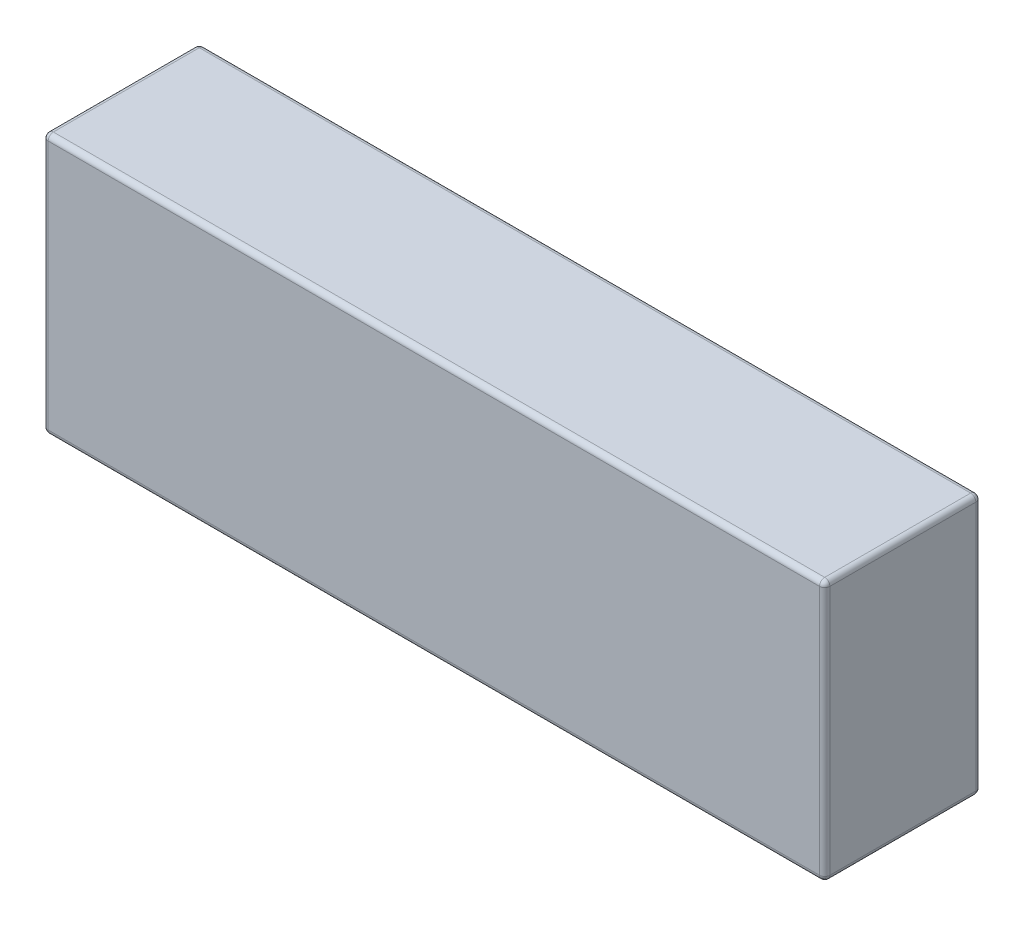
ISO-10303-21;
HEADER;
FILE_DESCRIPTION(('STEP AP214'),'2;1');
FILE_NAME('part.step','',(''),(''),'','','');
FILE_SCHEMA(('AUTOMOTIVE_DESIGN { 1 0 10303 214 1 1 1 1 }'));
ENDSEC;
DATA;
#1=APPLICATION_CONTEXT('core data for automotive mechanical design processes');
#2=APPLICATION_PROTOCOL_DEFINITION('international standard','automotive_design',2000,#1);
#3=PRODUCT_CONTEXT('',#1,'mechanical');
#4=PRODUCT('Part','Part','',(#3));
#5=PRODUCT_RELATED_PRODUCT_CATEGORY('part','',(#4));
#6=PRODUCT_DEFINITION_FORMATION('','',#4);
#7=PRODUCT_DEFINITION_CONTEXT('part definition',#1,'design');
#8=PRODUCT_DEFINITION('design','',#6,#7);
#9=PRODUCT_DEFINITION_SHAPE('','',#8);
#10=(LENGTH_UNIT() NAMED_UNIT(*) SI_UNIT(.MILLI.,.METRE.));
#11=(NAMED_UNIT(*) PLANE_ANGLE_UNIT() SI_UNIT($,.RADIAN.));
#12=(NAMED_UNIT(*) SI_UNIT($,.STERADIAN.) SOLID_ANGLE_UNIT());
#13=UNCERTAINTY_MEASURE_WITH_UNIT(LENGTH_MEASURE(1.E-05),#10,'distance_accuracy_value','');
#14=(GEOMETRIC_REPRESENTATION_CONTEXT(3) GLOBAL_UNCERTAINTY_ASSIGNED_CONTEXT((#13)) GLOBAL_UNIT_ASSIGNED_CONTEXT((#10,
#11,#12)) REPRESENTATION_CONTEXT('',''));
#15=CARTESIAN_POINT('',(0.,0.,0.));
#16=DIRECTION('',(0.,0.,1.));
#17=DIRECTION('',(1.,0.,0.));
#18=AXIS2_PLACEMENT_3D('',#15,#16,#17);
#19=CARTESIAN_POINT('',(75.,25.,28.));
#20=DIRECTION('',(-1.,0.,0.));
#21=DIRECTION('',(0.,0.,1.));
#22=AXIS2_PLACEMENT_3D('',#19,#20,#21);
#23=PLANE('',#22);
#24=DIRECTION('',(0.,-1.,0.));
#25=VECTOR('',#24,1.);
#26=CARTESIAN_POINT('',(75.,25.,0.));
#27=LINE('',#26,#25);
#28=CARTESIAN_POINT('',(75.,-24.,0.));
#29=VERTEX_POINT('',#28);
#30=CARTESIAN_POINT('',(75.,24.,0.));
#31=VERTEX_POINT('',#30);
#32=EDGE_CURVE('E207',#29,#31,#27,.F.);
#33=ORIENTED_EDGE('',*,*,#32,.T.);
#34=DIRECTION('',(0.,0.,-1.));
#35=VECTOR('',#34,1.);
#36=CARTESIAN_POINT('',(75.,24.,28.));
#37=LINE('',#36,#35);
#38=CARTESIAN_POINT('',(75.,24.,28.));
#39=VERTEX_POINT('',#38);
#40=EDGE_CURVE('E210',#31,#39,#37,.F.);
#41=ORIENTED_EDGE('',*,*,#40,.T.);
#42=DIRECTION('',(0.,1.,0.));
#43=VECTOR('',#42,1.);
#44=CARTESIAN_POINT('',(75.,-25.,28.));
#45=LINE('',#44,#43);
#46=CARTESIAN_POINT('',(75.,-24.,28.));
#47=VERTEX_POINT('',#46);
#48=EDGE_CURVE('E201',#39,#47,#45,.F.);
#49=ORIENTED_EDGE('',*,*,#48,.T.);
#50=DIRECTION('',(0.,0.,-1.));
#51=VECTOR('',#50,1.);
#52=CARTESIAN_POINT('',(75.,-24.,28.));
#53=LINE('',#52,#51);
#54=EDGE_CURVE('E204',#47,#29,#53,.T.);
#55=ORIENTED_EDGE('',*,*,#54,.T.);
#56=EDGE_LOOP('',(#33,#41,#49,#55));
#57=FACE_BOUND('',#56,.T.);
#58=ADVANCED_FACE('F44',(#57),#23,.F.);
#59=CARTESIAN_POINT('',(-75.,25.,28.));
#60=DIRECTION('',(0.,-1.,0.));
#61=DIRECTION('',(0.,0.,-1.));
#62=AXIS2_PLACEMENT_3D('',#59,#60,#61);
#63=PLANE('',#62);
#64=DIRECTION('',(1.,0.,0.));
#65=VECTOR('',#64,1.);
#66=CARTESIAN_POINT('',(-75.,25.,0.));
#67=LINE('',#66,#65);
#68=CARTESIAN_POINT('',(74.,25.,0.));
#69=VERTEX_POINT('',#68);
#70=CARTESIAN_POINT('',(-74.,25.,0.));
#71=VERTEX_POINT('',#70);
#72=EDGE_CURVE('E183',#69,#71,#67,.F.);
#73=ORIENTED_EDGE('',*,*,#72,.T.);
#74=DIRECTION('',(0.,0.,-1.));
#75=VECTOR('',#74,1.);
#76=CARTESIAN_POINT('',(-74.,25.,28.));
#77=LINE('',#76,#75);
#78=CARTESIAN_POINT('',(-74.,25.,28.));
#79=VERTEX_POINT('',#78);
#80=EDGE_CURVE('E140',#71,#79,#77,.F.);
#81=ORIENTED_EDGE('',*,*,#80,.T.);
#82=DIRECTION('',(-1.,0.,0.));
#83=VECTOR('',#82,1.);
#84=CARTESIAN_POINT('',(75.,25.,28.));
#85=LINE('',#84,#83);
#86=CARTESIAN_POINT('',(74.,25.,28.));
#87=VERTEX_POINT('',#86);
#88=EDGE_CURVE('E172',#79,#87,#85,.F.);
#89=ORIENTED_EDGE('',*,*,#88,.T.);
#90=DIRECTION('',(0.,0.,-1.));
#91=VECTOR('',#90,1.);
#92=CARTESIAN_POINT('',(74.,25.,28.));
#93=LINE('',#92,#91);
#94=EDGE_CURVE('E176',#87,#69,#93,.T.);
#95=ORIENTED_EDGE('',*,*,#94,.T.);
#96=EDGE_LOOP('',(#73,#81,#89,#95));
#97=FACE_BOUND('',#96,.T.);
#98=ADVANCED_FACE('F345',(#97),#63,.F.);
#99=CARTESIAN_POINT('',(-75.,25.,28.));
#100=DIRECTION('',(1.,0.,0.));
#101=DIRECTION('',(0.,1.,0.));
#102=AXIS2_PLACEMENT_3D('',#99,#100,#101);
#103=PLANE('',#102);
#104=DIRECTION('',(0.,-1.,0.));
#105=VECTOR('',#104,1.);
#106=CARTESIAN_POINT('',(-75.,25.,28.));
#107=LINE('',#106,#105);
#108=CARTESIAN_POINT('',(-75.,-24.,28.));
#109=VERTEX_POINT('',#108);
#110=CARTESIAN_POINT('',(-75.,24.,28.));
#111=VERTEX_POINT('',#110);
#112=EDGE_CURVE('E169',#109,#111,#107,.F.);
#113=ORIENTED_EDGE('',*,*,#112,.T.);
#114=DIRECTION('',(0.,0.,-1.));
#115=VECTOR('',#114,1.);
#116=CARTESIAN_POINT('',(-75.,24.,28.));
#117=LINE('',#116,#115);
#118=CARTESIAN_POINT('',(-75.,24.,0.));
#119=VERTEX_POINT('',#118);
#120=EDGE_CURVE('E138',#111,#119,#117,.T.);
#121=ORIENTED_EDGE('',*,*,#120,.T.);
#122=DIRECTION('',(0.,1.,0.));
#123=VECTOR('',#122,1.);
#124=CARTESIAN_POINT('',(-75.,-25.,0.));
#125=LINE('',#124,#123);
#126=CARTESIAN_POINT('',(-75.,-24.,0.));
#127=VERTEX_POINT('',#126);
#128=EDGE_CURVE('E158',#119,#127,#125,.F.);
#129=ORIENTED_EDGE('',*,*,#128,.T.);
#130=DIRECTION('',(0.,0.,-1.));
#131=VECTOR('',#130,1.);
#132=CARTESIAN_POINT('',(-75.,-24.,28.));
#133=LINE('',#132,#131);
#134=EDGE_CURVE('E165',#127,#109,#133,.F.);
#135=ORIENTED_EDGE('',*,*,#134,.T.);
#136=EDGE_LOOP('',(#113,#121,#129,#135));
#137=FACE_BOUND('',#136,.T.);
#138=ADVANCED_FACE('F167',(#137),#103,.F.);
#139=CARTESIAN_POINT('',(-75.,-25.,28.));
#140=DIRECTION('',(0.,1.,0.));
#141=DIRECTION('',(0.,0.,1.));
#142=AXIS2_PLACEMENT_3D('',#139,#140,#141);
#143=PLANE('',#142);
#144=DIRECTION('',(-1.,0.,0.));
#145=VECTOR('',#144,1.);
#146=CARTESIAN_POINT('',(75.,-25.,0.));
#147=LINE('',#146,#145);
#148=CARTESIAN_POINT('',(-74.,-25.,0.));
#149=VERTEX_POINT('',#148);
#150=CARTESIAN_POINT('',(74.,-25.,0.));
#151=VERTEX_POINT('',#150);
#152=EDGE_CURVE('E214',#149,#151,#147,.F.);
#153=ORIENTED_EDGE('',*,*,#152,.T.);
#154=DIRECTION('',(0.,0.,-1.));
#155=VECTOR('',#154,1.);
#156=CARTESIAN_POINT('',(74.,-25.,28.));
#157=LINE('',#156,#155);
#158=CARTESIAN_POINT('',(74.,-25.,28.));
#159=VERTEX_POINT('',#158);
#160=EDGE_CURVE('E223',#151,#159,#157,.F.);
#161=ORIENTED_EDGE('',*,*,#160,.T.);
#162=DIRECTION('',(1.,0.,0.));
#163=VECTOR('',#162,1.);
#164=CARTESIAN_POINT('',(-75.,-25.,28.));
#165=LINE('',#164,#163);
#166=CARTESIAN_POINT('',(-74.,-25.,28.));
#167=VERTEX_POINT('',#166);
#168=EDGE_CURVE('E220',#159,#167,#165,.F.);
#169=ORIENTED_EDGE('',*,*,#168,.T.);
#170=DIRECTION('',(0.,0.,-1.));
#171=VECTOR('',#170,1.);
#172=CARTESIAN_POINT('',(-74.,-25.,28.));
#173=LINE('',#172,#171);
#174=EDGE_CURVE('E217',#167,#149,#173,.T.);
#175=ORIENTED_EDGE('',*,*,#174,.T.);
#176=EDGE_LOOP('',(#153,#161,#169,#175));
#177=FACE_BOUND('',#176,.T.);
#178=ADVANCED_FACE('F368',(#177),#143,.F.);
#179=CARTESIAN_POINT('',(0.,0.,29.));
#180=DIRECTION('',(0.,0.,1.));
#181=DIRECTION('',(1.,0.,0.));
#182=AXIS2_PLACEMENT_3D('',#179,#180,#181);
#183=PLANE('',#182);
#184=DIRECTION('',(0.,-1.,0.));
#185=VECTOR('',#184,1.);
#186=CARTESIAN_POINT('',(-74.,-25.,29.));
#187=LINE('',#186,#185);
#188=CARTESIAN_POINT('',(-74.,24.,29.));
#189=VERTEX_POINT('',#188);
#190=CARTESIAN_POINT('',(-74.,-24.,29.));
#191=VERTEX_POINT('',#190);
#192=EDGE_CURVE('E54',#189,#191,#187,.T.);
#193=ORIENTED_EDGE('',*,*,#192,.T.);
#194=DIRECTION('',(1.,0.,0.));
#195=VECTOR('',#194,1.);
#196=CARTESIAN_POINT('',(75.,-24.,29.));
#197=LINE('',#196,#195);
#198=CARTESIAN_POINT('',(74.,-24.,29.));
#199=VERTEX_POINT('',#198);
#200=EDGE_CURVE('E11',#191,#199,#197,.T.);
#201=ORIENTED_EDGE('',*,*,#200,.T.);
#202=DIRECTION('',(0.,1.,0.));
#203=VECTOR('',#202,1.);
#204=CARTESIAN_POINT('',(74.,25.,29.));
#205=LINE('',#204,#203);
#206=CARTESIAN_POINT('',(74.,24.,29.));
#207=VERTEX_POINT('',#206);
#208=EDGE_CURVE('E227',#199,#207,#205,.T.);
#209=ORIENTED_EDGE('',*,*,#208,.T.);
#210=DIRECTION('',(-1.,0.,0.));
#211=VECTOR('',#210,1.);
#212=CARTESIAN_POINT('',(-75.,24.,29.));
#213=LINE('',#212,#211);
#214=EDGE_CURVE('E65',#207,#189,#213,.T.);
#215=ORIENTED_EDGE('',*,*,#214,.T.);
#216=EDGE_LOOP('',(#193,#201,#209,#215));
#217=FACE_BOUND('',#216,.T.);
#218=ADVANCED_FACE('F326',(#217),#183,.T.);
#219=CARTESIAN_POINT('',(0.,0.,-1.));
#220=DIRECTION('',(0.,0.,-1.));
#221=DIRECTION('',(-1.,0.,0.));
#222=AXIS2_PLACEMENT_3D('',#219,#220,#221);
#223=PLANE('',#222);
#224=DIRECTION('',(0.,1.,0.));
#225=VECTOR('',#224,1.);
#226=CARTESIAN_POINT('',(-74.,25.,-1.));
#227=LINE('',#226,#225);
#228=CARTESIAN_POINT('',(-74.,-24.,-1.));
#229=VERTEX_POINT('',#228);
#230=CARTESIAN_POINT('',(-74.,24.,-1.));
#231=VERTEX_POINT('',#230);
#232=EDGE_CURVE('E188',#229,#231,#227,.T.);
#233=ORIENTED_EDGE('',*,*,#232,.T.);
#234=DIRECTION('',(1.,0.,0.));
#235=VECTOR('',#234,1.);
#236=CARTESIAN_POINT('',(75.,24.,-1.));
#237=LINE('',#236,#235);
#238=CARTESIAN_POINT('',(74.,24.,-1.));
#239=VERTEX_POINT('',#238);
#240=EDGE_CURVE('E197',#231,#239,#237,.T.);
#241=ORIENTED_EDGE('',*,*,#240,.T.);
#242=DIRECTION('',(0.,-1.,0.));
#243=VECTOR('',#242,1.);
#244=CARTESIAN_POINT('',(74.,-25.,-1.));
#245=LINE('',#244,#243);
#246=CARTESIAN_POINT('',(74.,-24.,-1.));
#247=VERTEX_POINT('',#246);
#248=EDGE_CURVE('E194',#239,#247,#245,.T.);
#249=ORIENTED_EDGE('',*,*,#248,.T.);
#250=DIRECTION('',(-1.,0.,0.));
#251=VECTOR('',#250,1.);
#252=CARTESIAN_POINT('',(-75.,-24.,-1.));
#253=LINE('',#252,#251);
#254=EDGE_CURVE('E191',#247,#229,#253,.T.);
#255=ORIENTED_EDGE('',*,*,#254,.T.);
#256=EDGE_LOOP('',(#233,#241,#249,#255));
#257=FACE_BOUND('',#256,.T.);
#258=ADVANCED_FACE('F353',(#257),#223,.T.);
#259=CARTESIAN_POINT('',(74.,-24.,28.));
#260=DIRECTION('',(0.,0.,-1.));
#261=DIRECTION('',(-1.,0.,0.));
#262=AXIS2_PLACEMENT_3D('',#259,#260,#261);
#263=CYLINDRICAL_SURFACE('',#262,1.);
#264=CARTESIAN_POINT('',(74.,-24.,28.));
#265=DIRECTION('',(0.,0.,1.));
#266=DIRECTION('',(1.,0.,0.));
#267=AXIS2_PLACEMENT_3D('',#264,#265,#266);
#268=CIRCLE('',#267,1.);
#269=EDGE_CURVE('E48',#159,#47,#268,.T.);
#270=ORIENTED_EDGE('',*,*,#269,.F.);
#271=ORIENTED_EDGE('',*,*,#160,.F.);
#272=CARTESIAN_POINT('',(74.,-24.,0.));
#273=DIRECTION('',(0.,0.,-1.));
#274=DIRECTION('',(-1.,0.,0.));
#275=AXIS2_PLACEMENT_3D('',#272,#273,#274);
#276=CIRCLE('',#275,1.);
#277=EDGE_CURVE('E304',#29,#151,#276,.T.);
#278=ORIENTED_EDGE('',*,*,#277,.F.);
#279=ORIENTED_EDGE('',*,*,#54,.F.);
#280=EDGE_LOOP('',(#270,#271,#278,#279));
#281=FACE_BOUND('',#280,.T.);
#282=ADVANCED_FACE('F46',(#281),#263,.T.);
#283=CARTESIAN_POINT('',(74.,-24.,28.));
#284=DIRECTION('',(1.,0.,0.));
#285=DIRECTION('',(0.,0.,-1.));
#286=AXIS2_PLACEMENT_3D('',#283,#284,#285);
#287=SPHERICAL_SURFACE('',#286,1.);
#288=CARTESIAN_POINT('',(74.,-24.,28.));
#289=DIRECTION('',(1.,0.,0.));
#290=DIRECTION('',(0.,0.,-1.));
#291=AXIS2_PLACEMENT_3D('',#288,#289,#290);
#292=CIRCLE('',#291,1.);
#293=EDGE_CURVE('E297',#159,#199,#292,.F.);
#294=ORIENTED_EDGE('',*,*,#293,.F.);
#295=ORIENTED_EDGE('',*,*,#269,.T.);
#296=CARTESIAN_POINT('',(74.,-24.,28.));
#297=DIRECTION('',(0.,-1.,0.));
#298=DIRECTION('',(0.,0.,-1.));
#299=AXIS2_PLACEMENT_3D('',#296,#297,#298);
#300=CIRCLE('',#299,1.);
#301=EDGE_CURVE('E301',#199,#47,#300,.F.);
#302=ORIENTED_EDGE('',*,*,#301,.F.);
#303=EDGE_LOOP('',(#294,#295,#302));
#304=FACE_BOUND('',#303,.T.);
#305=ADVANCED_FACE('F317',(#304),#287,.T.);
#306=CARTESIAN_POINT('',(74.,-24.,0.));
#307=DIRECTION('',(0.,-1.,0.));
#308=DIRECTION('',(0.,0.,-1.));
#309=AXIS2_PLACEMENT_3D('',#306,#307,#308);
#310=SPHERICAL_SURFACE('',#309,1.);
#311=CARTESIAN_POINT('',(74.,-24.,0.));
#312=DIRECTION('',(0.,-1.,0.));
#313=DIRECTION('',(0.,0.,-1.));
#314=AXIS2_PLACEMENT_3D('',#311,#312,#313);
#315=CIRCLE('',#314,1.);
#316=EDGE_CURVE('E289',#29,#247,#315,.F.);
#317=ORIENTED_EDGE('',*,*,#316,.F.);
#318=ORIENTED_EDGE('',*,*,#277,.T.);
#319=CARTESIAN_POINT('',(74.,-24.,0.));
#320=DIRECTION('',(1.,0.,0.));
#321=DIRECTION('',(0.,0.,-1.));
#322=AXIS2_PLACEMENT_3D('',#319,#320,#321);
#323=CIRCLE('',#322,1.);
#324=EDGE_CURVE('E293',#247,#151,#323,.F.);
#325=ORIENTED_EDGE('',*,*,#324,.F.);
#326=EDGE_LOOP('',(#317,#318,#325));
#327=FACE_BOUND('',#326,.T.);
#328=ADVANCED_FACE('F370',(#327),#310,.T.);
#329=CARTESIAN_POINT('',(74.,0.,28.));
#330=DIRECTION('',(0.,-1.,0.));
#331=DIRECTION('',(0.,0.,-1.));
#332=AXIS2_PLACEMENT_3D('',#329,#330,#331);
#333=CYLINDRICAL_SURFACE('',#332,1.);
#334=ORIENTED_EDGE('',*,*,#301,.T.);
#335=ORIENTED_EDGE('',*,*,#48,.F.);
#336=CARTESIAN_POINT('',(74.,24.,28.));
#337=DIRECTION('',(0.,1.,0.));
#338=DIRECTION('',(0.,0.,1.));
#339=AXIS2_PLACEMENT_3D('',#336,#337,#338);
#340=CIRCLE('',#339,1.);
#341=EDGE_CURVE('E282',#207,#39,#340,.T.);
#342=ORIENTED_EDGE('',*,*,#341,.F.);
#343=ORIENTED_EDGE('',*,*,#208,.F.);
#344=EDGE_LOOP('',(#334,#335,#342,#343));
#345=FACE_BOUND('',#344,.T.);
#346=ADVANCED_FACE('F323',(#345),#333,.T.);
#347=CARTESIAN_POINT('',(0.,-24.,28.));
#348=DIRECTION('',(-1.,0.,0.));
#349=DIRECTION('',(0.,0.,1.));
#350=AXIS2_PLACEMENT_3D('',#347,#348,#349);
#351=CYLINDRICAL_SURFACE('',#350,1.);
#352=ORIENTED_EDGE('',*,*,#293,.T.);
#353=ORIENTED_EDGE('',*,*,#200,.F.);
#354=CARTESIAN_POINT('',(-74.,-24.,28.));
#355=DIRECTION('',(-1.,0.,0.));
#356=DIRECTION('',(0.,0.,1.));
#357=AXIS2_PLACEMENT_3D('',#354,#355,#356);
#358=CIRCLE('',#357,1.);
#359=EDGE_CURVE('E278',#167,#191,#358,.T.);
#360=ORIENTED_EDGE('',*,*,#359,.F.);
#361=ORIENTED_EDGE('',*,*,#168,.F.);
#362=EDGE_LOOP('',(#352,#353,#360,#361));
#363=FACE_BOUND('',#362,.T.);
#364=ADVANCED_FACE('F329',(#363),#351,.T.);
#365=CARTESIAN_POINT('',(-74.,-24.,28.));
#366=DIRECTION('',(0.,0.,-1.));
#367=DIRECTION('',(-1.,0.,0.));
#368=AXIS2_PLACEMENT_3D('',#365,#366,#367);
#369=CYLINDRICAL_SURFACE('',#368,1.);
#370=CARTESIAN_POINT('',(-74.,-24.,0.));
#371=DIRECTION('',(0.,0.,-1.));
#372=DIRECTION('',(-1.,0.,0.));
#373=AXIS2_PLACEMENT_3D('',#370,#371,#372);
#374=CIRCLE('',#373,1.);
#375=EDGE_CURVE('E270',#149,#127,#374,.T.);
#376=ORIENTED_EDGE('',*,*,#375,.F.);
#377=ORIENTED_EDGE('',*,*,#174,.F.);
#378=CARTESIAN_POINT('',(-74.,-24.,28.));
#379=DIRECTION('',(0.,0.,1.));
#380=DIRECTION('',(1.,0.,0.));
#381=AXIS2_PLACEMENT_3D('',#378,#379,#380);
#382=CIRCLE('',#381,1.);
#383=EDGE_CURVE('E274',#109,#167,#382,.T.);
#384=ORIENTED_EDGE('',*,*,#383,.F.);
#385=ORIENTED_EDGE('',*,*,#134,.F.);
#386=EDGE_LOOP('',(#376,#377,#384,#385));
#387=FACE_BOUND('',#386,.T.);
#388=ADVANCED_FACE('F365',(#387),#369,.T.);
#389=CARTESIAN_POINT('',(0.,-24.,0.));
#390=DIRECTION('',(1.,0.,0.));
#391=DIRECTION('',(0.,0.,-1.));
#392=AXIS2_PLACEMENT_3D('',#389,#390,#391);
#393=CYLINDRICAL_SURFACE('',#392,1.);
#394=ORIENTED_EDGE('',*,*,#324,.T.);
#395=ORIENTED_EDGE('',*,*,#152,.F.);
#396=CARTESIAN_POINT('',(-74.,-24.,0.));
#397=DIRECTION('',(-1.,0.,0.));
#398=DIRECTION('',(0.,-1.,0.));
#399=AXIS2_PLACEMENT_3D('',#396,#397,#398);
#400=CIRCLE('',#399,1.);
#401=EDGE_CURVE('E266',#229,#149,#400,.T.);
#402=ORIENTED_EDGE('',*,*,#401,.F.);
#403=ORIENTED_EDGE('',*,*,#254,.F.);
#404=EDGE_LOOP('',(#394,#395,#402,#403));
#405=FACE_BOUND('',#404,.T.);
#406=ADVANCED_FACE('F359',(#405),#393,.T.);
#407=CARTESIAN_POINT('',(74.,0.,0.));
#408=DIRECTION('',(0.,1.,0.));
#409=DIRECTION('',(0.,0.,1.));
#410=AXIS2_PLACEMENT_3D('',#407,#408,#409);
#411=CYLINDRICAL_SURFACE('',#410,1.);
#412=ORIENTED_EDGE('',*,*,#316,.T.);
#413=ORIENTED_EDGE('',*,*,#248,.F.);
#414=CARTESIAN_POINT('',(74.,24.,0.));
#415=DIRECTION('',(0.,1.,0.));
#416=DIRECTION('',(0.,0.,1.));
#417=AXIS2_PLACEMENT_3D('',#414,#415,#416);
#418=CIRCLE('',#417,1.);
#419=EDGE_CURVE('E262',#31,#239,#418,.T.);
#420=ORIENTED_EDGE('',*,*,#419,.F.);
#421=ORIENTED_EDGE('',*,*,#32,.F.);
#422=EDGE_LOOP('',(#412,#413,#420,#421));
#423=FACE_BOUND('',#422,.T.);
#424=ADVANCED_FACE('F373',(#423),#411,.T.);
#425=CARTESIAN_POINT('',(74.,24.,28.));
#426=DIRECTION('',(0.,0.,-1.));
#427=DIRECTION('',(-1.,0.,0.));
#428=AXIS2_PLACEMENT_3D('',#425,#426,#427);
#429=CYLINDRICAL_SURFACE('',#428,1.);
#430=CARTESIAN_POINT('',(74.,24.,28.));
#431=DIRECTION('',(0.,0.,1.));
#432=DIRECTION('',(1.,0.,0.));
#433=AXIS2_PLACEMENT_3D('',#430,#431,#432);
#434=CIRCLE('',#433,1.);
#435=EDGE_CURVE('E285',#39,#87,#434,.T.);
#436=ORIENTED_EDGE('',*,*,#435,.F.);
#437=ORIENTED_EDGE('',*,*,#40,.F.);
#438=CARTESIAN_POINT('',(74.,24.,0.));
#439=DIRECTION('',(0.,0.,-1.));
#440=DIRECTION('',(-1.,0.,0.));
#441=AXIS2_PLACEMENT_3D('',#438,#439,#440);
#442=CIRCLE('',#441,1.);
#443=EDGE_CURVE('E258',#69,#31,#442,.T.);
#444=ORIENTED_EDGE('',*,*,#443,.F.);
#445=ORIENTED_EDGE('',*,*,#94,.F.);
#446=EDGE_LOOP('',(#436,#437,#444,#445));
#447=FACE_BOUND('',#446,.T.);
#448=ADVANCED_FACE('F378',(#447),#429,.T.);
#449=CARTESIAN_POINT('',(74.,24.,28.));
#450=DIRECTION('',(1.,0.,0.));
#451=DIRECTION('',(0.,0.,-1.));
#452=AXIS2_PLACEMENT_3D('',#449,#450,#451);
#453=SPHERICAL_SURFACE('',#452,1.);
#454=ORIENTED_EDGE('',*,*,#341,.T.);
#455=ORIENTED_EDGE('',*,*,#435,.T.);
#456=CARTESIAN_POINT('',(74.,24.,28.));
#457=DIRECTION('',(1.,0.,0.));
#458=DIRECTION('',(0.,0.,-1.));
#459=AXIS2_PLACEMENT_3D('',#456,#457,#458);
#460=CIRCLE('',#459,1.);
#461=EDGE_CURVE('E254',#207,#87,#460,.F.);
#462=ORIENTED_EDGE('',*,*,#461,.F.);
#463=EDGE_LOOP('',(#454,#455,#462));
#464=FACE_BOUND('',#463,.T.);
#465=ADVANCED_FACE('F380',(#464),#453,.T.);
#466=CARTESIAN_POINT('',(-74.,-24.,28.));
#467=DIRECTION('',(0.,-1.,0.));
#468=DIRECTION('',(0.,0.,-1.));
#469=AXIS2_PLACEMENT_3D('',#466,#467,#468);
#470=SPHERICAL_SURFACE('',#469,1.);
#471=ORIENTED_EDGE('',*,*,#383,.T.);
#472=ORIENTED_EDGE('',*,*,#359,.T.);
#473=CARTESIAN_POINT('',(-74.,-24.,28.));
#474=DIRECTION('',(0.,-1.,0.));
#475=DIRECTION('',(0.,0.,-1.));
#476=AXIS2_PLACEMENT_3D('',#473,#474,#475);
#477=CIRCLE('',#476,1.);
#478=EDGE_CURVE('E250',#109,#191,#477,.F.);
#479=ORIENTED_EDGE('',*,*,#478,.F.);
#480=EDGE_LOOP('',(#471,#472,#479));
#481=FACE_BOUND('',#480,.T.);
#482=ADVANCED_FACE('F332',(#481),#470,.T.);
#483=CARTESIAN_POINT('',(-74.,-24.,0.));
#484=DIRECTION('',(0.,-1.,0.));
#485=DIRECTION('',(0.,0.,-1.));
#486=AXIS2_PLACEMENT_3D('',#483,#484,#485);
#487=SPHERICAL_SURFACE('',#486,1.);
#488=ORIENTED_EDGE('',*,*,#401,.T.);
#489=ORIENTED_EDGE('',*,*,#375,.T.);
#490=CARTESIAN_POINT('',(-74.,-24.,0.));
#491=DIRECTION('',(0.,-1.,0.));
#492=DIRECTION('',(0.,0.,-1.));
#493=AXIS2_PLACEMENT_3D('',#490,#491,#492);
#494=CIRCLE('',#493,1.);
#495=EDGE_CURVE('E161',#229,#127,#494,.F.);
#496=ORIENTED_EDGE('',*,*,#495,.F.);
#497=EDGE_LOOP('',(#488,#489,#496));
#498=FACE_BOUND('',#497,.T.);
#499=ADVANCED_FACE('F362',(#498),#487,.T.);
#500=CARTESIAN_POINT('',(74.,24.,0.));
#501=DIRECTION('',(1.,0.,0.));
#502=DIRECTION('',(0.,0.,-1.));
#503=AXIS2_PLACEMENT_3D('',#500,#501,#502);
#504=SPHERICAL_SURFACE('',#503,1.);
#505=ORIENTED_EDGE('',*,*,#443,.T.);
#506=ORIENTED_EDGE('',*,*,#419,.T.);
#507=CARTESIAN_POINT('',(74.,24.,0.));
#508=DIRECTION('',(1.,0.,0.));
#509=DIRECTION('',(0.,0.,-1.));
#510=AXIS2_PLACEMENT_3D('',#507,#508,#509);
#511=CIRCLE('',#510,1.);
#512=EDGE_CURVE('E245',#69,#239,#511,.F.);
#513=ORIENTED_EDGE('',*,*,#512,.F.);
#514=EDGE_LOOP('',(#505,#506,#513));
#515=FACE_BOUND('',#514,.T.);
#516=ADVANCED_FACE('F411',(#515),#504,.T.);
#517=CARTESIAN_POINT('',(0.,24.,28.));
#518=DIRECTION('',(1.,0.,0.));
#519=DIRECTION('',(0.,0.,-1.));
#520=AXIS2_PLACEMENT_3D('',#517,#518,#519);
#521=CYLINDRICAL_SURFACE('',#520,1.);
#522=ORIENTED_EDGE('',*,*,#461,.T.);
#523=ORIENTED_EDGE('',*,*,#88,.F.);
#524=CARTESIAN_POINT('',(-74.,24.,28.));
#525=DIRECTION('',(-1.,0.,0.));
#526=DIRECTION('',(0.,-1.,0.));
#527=AXIS2_PLACEMENT_3D('',#524,#525,#526);
#528=CIRCLE('',#527,1.);
#529=EDGE_CURVE('E241',#189,#79,#528,.T.);
#530=ORIENTED_EDGE('',*,*,#529,.F.);
#531=ORIENTED_EDGE('',*,*,#214,.F.);
#532=EDGE_LOOP('',(#522,#523,#530,#531));
#533=FACE_BOUND('',#532,.T.);
#534=ADVANCED_FACE('F342',(#533),#521,.T.);
#535=CARTESIAN_POINT('',(-74.,0.,28.));
#536=DIRECTION('',(0.,1.,0.));
#537=DIRECTION('',(-1.,0.,0.));
#538=AXIS2_PLACEMENT_3D('',#535,#536,#537);
#539=CYLINDRICAL_SURFACE('',#538,1.);
#540=ORIENTED_EDGE('',*,*,#478,.T.);
#541=ORIENTED_EDGE('',*,*,#192,.F.);
#542=CARTESIAN_POINT('',(-74.,24.,28.));
#543=DIRECTION('',(0.,1.,0.));
#544=DIRECTION('',(0.,0.,1.));
#545=AXIS2_PLACEMENT_3D('',#542,#543,#544);
#546=CIRCLE('',#545,1.);
#547=EDGE_CURVE('E155',#111,#189,#546,.T.);
#548=ORIENTED_EDGE('',*,*,#547,.F.);
#549=ORIENTED_EDGE('',*,*,#112,.F.);
#550=EDGE_LOOP('',(#540,#541,#548,#549));
#551=FACE_BOUND('',#550,.T.);
#552=ADVANCED_FACE('F335',(#551),#539,.T.);
#553=CARTESIAN_POINT('',(-74.,0.,0.));
#554=DIRECTION('',(0.,-1.,0.));
#555=DIRECTION('',(1.,0.,0.));
#556=AXIS2_PLACEMENT_3D('',#553,#554,#555);
#557=CYLINDRICAL_SURFACE('',#556,1.);
#558=ORIENTED_EDGE('',*,*,#495,.T.);
#559=ORIENTED_EDGE('',*,*,#128,.F.);
#560=CARTESIAN_POINT('',(-74.,24.,0.));
#561=DIRECTION('',(0.,1.,0.));
#562=DIRECTION('',(0.,0.,1.));
#563=AXIS2_PLACEMENT_3D('',#560,#561,#562);
#564=CIRCLE('',#563,1.);
#565=EDGE_CURVE('E147',#231,#119,#564,.T.);
#566=ORIENTED_EDGE('',*,*,#565,.F.);
#567=ORIENTED_EDGE('',*,*,#232,.F.);
#568=EDGE_LOOP('',(#558,#559,#566,#567));
#569=FACE_BOUND('',#568,.T.);
#570=ADVANCED_FACE('F159',(#569),#557,.T.);
#571=CARTESIAN_POINT('',(0.,24.,0.));
#572=DIRECTION('',(-1.,0.,0.));
#573=DIRECTION('',(0.,0.,1.));
#574=AXIS2_PLACEMENT_3D('',#571,#572,#573);
#575=CYLINDRICAL_SURFACE('',#574,1.);
#576=ORIENTED_EDGE('',*,*,#512,.T.);
#577=ORIENTED_EDGE('',*,*,#240,.F.);
#578=CARTESIAN_POINT('',(-74.,24.,0.));
#579=DIRECTION('',(-1.,0.,0.));
#580=DIRECTION('',(0.,0.,1.));
#581=AXIS2_PLACEMENT_3D('',#578,#579,#580);
#582=CIRCLE('',#581,1.);
#583=EDGE_CURVE('E151',#71,#231,#582,.T.);
#584=ORIENTED_EDGE('',*,*,#583,.F.);
#585=ORIENTED_EDGE('',*,*,#72,.F.);
#586=EDGE_LOOP('',(#576,#577,#584,#585));
#587=FACE_BOUND('',#586,.T.);
#588=ADVANCED_FACE('F350',(#587),#575,.T.);
#589=CARTESIAN_POINT('',(-74.,24.,28.));
#590=DIRECTION('',(0.,0.,1.));
#591=DIRECTION('',(1.,0.,0.));
#592=AXIS2_PLACEMENT_3D('',#589,#590,#591);
#593=SPHERICAL_SURFACE('',#592,1.);
#594=ORIENTED_EDGE('',*,*,#547,.T.);
#595=ORIENTED_EDGE('',*,*,#529,.T.);
#596=CARTESIAN_POINT('',(-74.,24.,28.));
#597=DIRECTION('',(0.,0.,1.));
#598=DIRECTION('',(1.,0.,0.));
#599=AXIS2_PLACEMENT_3D('',#596,#597,#598);
#600=CIRCLE('',#599,1.);
#601=EDGE_CURVE('E144',#111,#79,#600,.F.);
#602=ORIENTED_EDGE('',*,*,#601,.F.);
#603=EDGE_LOOP('',(#594,#595,#602));
#604=FACE_BOUND('',#603,.T.);
#605=ADVANCED_FACE('F339',(#604),#593,.T.);
#606=CARTESIAN_POINT('',(-74.,24.,0.));
#607=DIRECTION('',(0.,0.,-1.));
#608=DIRECTION('',(-1.,0.,0.));
#609=AXIS2_PLACEMENT_3D('',#606,#607,#608);
#610=SPHERICAL_SURFACE('',#609,1.);
#611=ORIENTED_EDGE('',*,*,#583,.T.);
#612=ORIENTED_EDGE('',*,*,#565,.T.);
#613=CARTESIAN_POINT('',(-74.,24.,0.));
#614=DIRECTION('',(0.,0.,-1.));
#615=DIRECTION('',(-1.,0.,0.));
#616=AXIS2_PLACEMENT_3D('',#613,#614,#615);
#617=CIRCLE('',#616,1.);
#618=EDGE_CURVE('E134',#71,#119,#617,.F.);
#619=ORIENTED_EDGE('',*,*,#618,.F.);
#620=EDGE_LOOP('',(#611,#612,#619));
#621=FACE_BOUND('',#620,.T.);
#622=ADVANCED_FACE('F149',(#621),#610,.T.);
#623=CARTESIAN_POINT('',(-74.,24.,28.));
#624=DIRECTION('',(0.,0.,-1.));
#625=DIRECTION('',(-1.,0.,0.));
#626=AXIS2_PLACEMENT_3D('',#623,#624,#625);
#627=CYLINDRICAL_SURFACE('',#626,1.);
#628=ORIENTED_EDGE('',*,*,#601,.T.);
#629=ORIENTED_EDGE('',*,*,#80,.F.);
#630=ORIENTED_EDGE('',*,*,#618,.T.);
#631=ORIENTED_EDGE('',*,*,#120,.F.);
#632=EDGE_LOOP('',(#628,#629,#630,#631));
#633=FACE_BOUND('',#632,.T.);
#634=ADVANCED_FACE('F136',(#633),#627,.T.);
#635=CLOSED_SHELL('',(#58,#98,#138,#178,#218,#258,#282,#305,#328,#346,#364,#388,#406,#424,#448,
#465,#482,#499,#516,#534,#552,#570,#588,#605,#622,#634));
#636=MANIFOLD_SOLID_BREP('B2',#635);
#637=ADVANCED_BREP_SHAPE_REPRESENTATION('',(#18,#636),#14);
#638=SHAPE_DEFINITION_REPRESENTATION(#9,#637);
ENDSEC;
END-ISO-10303-21;
